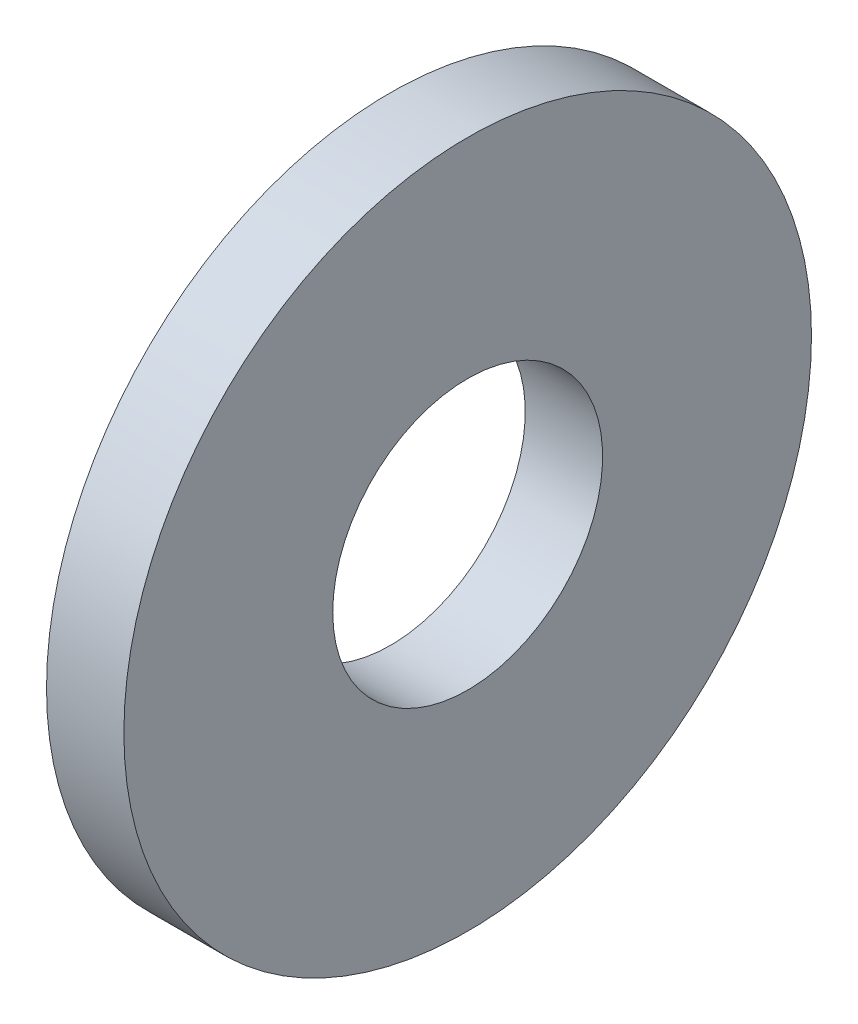
ISO-10303-21;
HEADER;
FILE_DESCRIPTION(('STEP AP214'),'2;1');
FILE_NAME('part.step','',(''),(''),'','','');
FILE_SCHEMA(('AUTOMOTIVE_DESIGN { 1 0 10303 214 1 1 1 1 }'));
ENDSEC;
DATA;
#1=APPLICATION_CONTEXT('core data for automotive mechanical design processes');
#2=APPLICATION_PROTOCOL_DEFINITION('international standard','automotive_design',2000,#1);
#3=PRODUCT_CONTEXT('',#1,'mechanical');
#4=PRODUCT('Part','Part','',(#3));
#5=PRODUCT_RELATED_PRODUCT_CATEGORY('part','',(#4));
#6=PRODUCT_DEFINITION_FORMATION('','',#4);
#7=PRODUCT_DEFINITION_CONTEXT('part definition',#1,'design');
#8=PRODUCT_DEFINITION('design','',#6,#7);
#9=PRODUCT_DEFINITION_SHAPE('','',#8);
#10=(LENGTH_UNIT() NAMED_UNIT(*) SI_UNIT(.MILLI.,.METRE.));
#11=(NAMED_UNIT(*) PLANE_ANGLE_UNIT() SI_UNIT($,.RADIAN.));
#12=(NAMED_UNIT(*) SI_UNIT($,.STERADIAN.) SOLID_ANGLE_UNIT());
#13=UNCERTAINTY_MEASURE_WITH_UNIT(LENGTH_MEASURE(1.E-05),#10,'distance_accuracy_value','');
#14=(GEOMETRIC_REPRESENTATION_CONTEXT(3) GLOBAL_UNCERTAINTY_ASSIGNED_CONTEXT((#13)) GLOBAL_UNIT_ASSIGNED_CONTEXT((#10,
#11,#12)) REPRESENTATION_CONTEXT('',''));
#15=CARTESIAN_POINT('',(0.,0.,0.));
#16=DIRECTION('',(0.,0.,1.));
#17=DIRECTION('',(1.,0.,0.));
#18=AXIS2_PLACEMENT_3D('',#15,#16,#17);
#19=CARTESIAN_POINT('',(-34.9249999999999,0.,0.));
#20=DIRECTION('',(-1.,0.,0.));
#21=DIRECTION('',(0.,0.,1.));
#22=AXIS2_PLACEMENT_3D('',#19,#20,#21);
#23=CYLINDRICAL_SURFACE('',#22,1.57);
#24=CARTESIAN_POINT('',(0.,0.,0.));
#25=DIRECTION('',(-1.,0.,0.));
#26=DIRECTION('',(0.,0.,1.));
#27=AXIS2_PLACEMENT_3D('',#24,#25,#26);
#28=CIRCLE('',#27,1.57);
#29=CARTESIAN_POINT('',(0.,0.,1.57));
#30=VERTEX_POINT('',#29);
#31=EDGE_CURVE('E10',#30,#30,#28,.T.);
#32=ORIENTED_EDGE('',*,*,#31,.F.);
#33=EDGE_LOOP('',(#32));
#34=FACE_BOUND('',#33,.T.);
#35=CARTESIAN_POINT('',(-0.899999999999998,0.,0.));
#36=DIRECTION('',(-1.,0.,0.));
#37=DIRECTION('',(0.,0.,1.));
#38=AXIS2_PLACEMENT_3D('',#35,#36,#37);
#39=CIRCLE('',#38,1.57);
#40=CARTESIAN_POINT('',(-0.899999999999998,0.,1.57));
#41=VERTEX_POINT('',#40);
#42=EDGE_CURVE('E47',#41,#41,#39,.T.);
#43=ORIENTED_EDGE('',*,*,#42,.T.);
#44=EDGE_LOOP('',(#43));
#45=FACE_BOUND('',#44,.T.);
#46=ADVANCED_FACE('F33',(#34,#45),#23,.F.);
#47=CARTESIAN_POINT('',(0.,1.57,0.));
#48=DIRECTION('',(-1.,0.,0.));
#49=DIRECTION('',(0.,0.,1.));
#50=AXIS2_PLACEMENT_3D('',#47,#48,#49);
#51=PLANE('',#50);
#52=CARTESIAN_POINT('',(0.,0.,0.));
#53=DIRECTION('',(-1.,0.,0.));
#54=DIRECTION('',(0.,0.,1.));
#55=AXIS2_PLACEMENT_3D('',#52,#53,#54);
#56=CIRCLE('',#55,4.);
#57=CARTESIAN_POINT('',(0.,0.,4.));
#58=VERTEX_POINT('',#57);
#59=EDGE_CURVE('E39',#58,#58,#56,.T.);
#60=ORIENTED_EDGE('',*,*,#59,.F.);
#61=EDGE_LOOP('',(#60));
#62=FACE_BOUND('',#61,.T.);
#63=ORIENTED_EDGE('',*,*,#31,.T.);
#64=EDGE_LOOP('',(#63));
#65=FACE_BOUND('',#64,.T.);
#66=ADVANCED_FACE('F62',(#62,#65),#51,.F.);
#67=CARTESIAN_POINT('',(-34.9249999999999,0.,0.));
#68=DIRECTION('',(-1.,0.,0.));
#69=DIRECTION('',(0.,0.,1.));
#70=AXIS2_PLACEMENT_3D('',#67,#68,#69);
#71=CYLINDRICAL_SURFACE('',#70,4.);
#72=CARTESIAN_POINT('',(-0.899999999999998,0.,0.));
#73=DIRECTION('',(-1.,0.,0.));
#74=DIRECTION('',(0.,0.,1.));
#75=AXIS2_PLACEMENT_3D('',#72,#73,#74);
#76=CIRCLE('',#75,4.);
#77=CARTESIAN_POINT('',(-0.899999999999998,0.,4.));
#78=VERTEX_POINT('',#77);
#79=EDGE_CURVE('E43',#78,#78,#76,.T.);
#80=ORIENTED_EDGE('',*,*,#79,.F.);
#81=EDGE_LOOP('',(#80));
#82=FACE_BOUND('',#81,.T.);
#83=ORIENTED_EDGE('',*,*,#59,.T.);
#84=EDGE_LOOP('',(#83));
#85=FACE_BOUND('',#84,.T.);
#86=ADVANCED_FACE('F57',(#82,#85),#71,.T.);
#87=CARTESIAN_POINT('',(-0.899999999999999,4.,0.));
#88=DIRECTION('',(1.,0.,0.));
#89=DIRECTION('',(0.,0.,-1.));
#90=AXIS2_PLACEMENT_3D('',#87,#88,#89);
#91=PLANE('',#90);
#92=ORIENTED_EDGE('',*,*,#42,.F.);
#93=EDGE_LOOP('',(#92));
#94=FACE_BOUND('',#93,.T.);
#95=ORIENTED_EDGE('',*,*,#79,.T.);
#96=EDGE_LOOP('',(#95));
#97=FACE_BOUND('',#96,.T.);
#98=ADVANCED_FACE('F54',(#94,#97),#91,.F.);
#99=CLOSED_SHELL('',(#46,#66,#86,#98));
#100=MANIFOLD_SOLID_BREP('B2',#99);
#101=ADVANCED_BREP_SHAPE_REPRESENTATION('',(#18,#100),#14);
#102=SHAPE_DEFINITION_REPRESENTATION(#9,#101);
ENDSEC;
END-ISO-10303-21;
